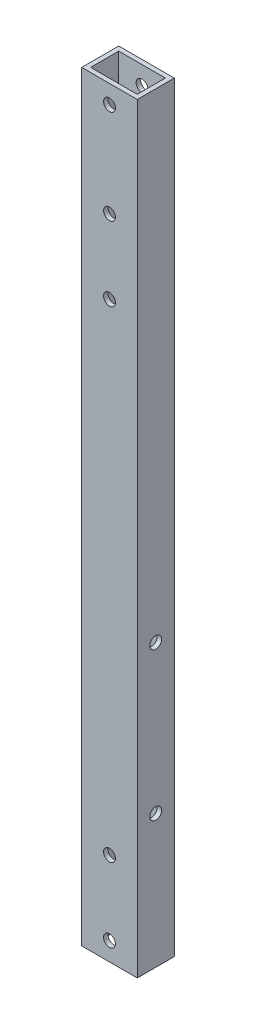
ISO-10303-21;
HEADER;
FILE_DESCRIPTION(('STEP AP214'),'2;1');
FILE_NAME('part.step','',(''),(''),'','','');
FILE_SCHEMA(('AUTOMOTIVE_DESIGN { 1 0 10303 214 1 1 1 1 }'));
ENDSEC;
DATA;
#1=APPLICATION_CONTEXT('core data for automotive mechanical design processes');
#2=APPLICATION_PROTOCOL_DEFINITION('international standard','automotive_design',2000,#1);
#3=PRODUCT_CONTEXT('',#1,'mechanical');
#4=PRODUCT('Part','Part','',(#3));
#5=PRODUCT_RELATED_PRODUCT_CATEGORY('part','',(#4));
#6=PRODUCT_DEFINITION_FORMATION('','',#4);
#7=PRODUCT_DEFINITION_CONTEXT('part definition',#1,'design');
#8=PRODUCT_DEFINITION('design','',#6,#7);
#9=PRODUCT_DEFINITION_SHAPE('','',#8);
#10=(LENGTH_UNIT() NAMED_UNIT(*) SI_UNIT(.MILLI.,.METRE.));
#11=(NAMED_UNIT(*) PLANE_ANGLE_UNIT() SI_UNIT($,.RADIAN.));
#12=(NAMED_UNIT(*) SI_UNIT($,.STERADIAN.) SOLID_ANGLE_UNIT());
#13=UNCERTAINTY_MEASURE_WITH_UNIT(LENGTH_MEASURE(1.E-05),#10,'distance_accuracy_value','');
#14=(GEOMETRIC_REPRESENTATION_CONTEXT(3) GLOBAL_UNCERTAINTY_ASSIGNED_CONTEXT((#13)) GLOBAL_UNIT_ASSIGNED_CONTEXT((#10,
#11,#12)) REPRESENTATION_CONTEXT('',''));
#15=CARTESIAN_POINT('',(0.,0.,0.));
#16=DIRECTION('',(0.,0.,1.));
#17=DIRECTION('',(1.,0.,0.));
#18=AXIS2_PLACEMENT_3D('',#15,#16,#17);
#19=CARTESIAN_POINT('',(7.5,110.,-5.));
#20=DIRECTION('',(-1.,0.,0.));
#21=DIRECTION('',(0.,0.,1.));
#22=AXIS2_PLACEMENT_3D('',#19,#20,#21);
#23=PLANE('',#22);
#24=CARTESIAN_POINT('',(7.5,-74.,0.));
#25=DIRECTION('',(1.,0.,0.));
#26=DIRECTION('',(0.,0.,-1.));
#27=AXIS2_PLACEMENT_3D('',#24,#25,#26);
#28=CIRCLE('',#27,1.60000000000001);
#29=CARTESIAN_POINT('',(7.5,-74.,-1.60000000000001));
#30=VERTEX_POINT('',#29);
#31=EDGE_CURVE('E154',#30,#30,#28,.T.);
#32=ORIENTED_EDGE('',*,*,#31,.F.);
#33=EDGE_LOOP('',(#32));
#34=FACE_BOUND('',#33,.T.);
#35=CARTESIAN_POINT('',(7.5,-34.,0.));
#36=DIRECTION('',(1.,0.,0.));
#37=DIRECTION('',(0.,0.,-1.));
#38=AXIS2_PLACEMENT_3D('',#35,#36,#37);
#39=CIRCLE('',#38,1.6);
#40=CARTESIAN_POINT('',(7.5,-34.,-1.6));
#41=VERTEX_POINT('',#40);
#42=EDGE_CURVE('E166',#41,#41,#39,.T.);
#43=ORIENTED_EDGE('',*,*,#42,.F.);
#44=EDGE_LOOP('',(#43));
#45=FACE_BOUND('',#44,.T.);
#46=DIRECTION('',(0.,0.,-1.));
#47=VECTOR('',#46,1.);
#48=CARTESIAN_POINT('',(7.5,95.5,5.));
#49=LINE('',#48,#47);
#50=CARTESIAN_POINT('',(7.5,95.5,5.));
#51=VERTEX_POINT('',#50);
#52=CARTESIAN_POINT('',(7.5,95.5,-5.));
#53=VERTEX_POINT('',#52);
#54=EDGE_CURVE('E96',#51,#53,#49,.T.);
#55=ORIENTED_EDGE('',*,*,#54,.F.);
#56=DIRECTION('',(0.,-1.,0.));
#57=VECTOR('',#56,1.);
#58=CARTESIAN_POINT('',(7.5,110.,5.));
#59=LINE('',#58,#57);
#60=CARTESIAN_POINT('',(7.5,-110.,5.));
#61=VERTEX_POINT('',#60);
#62=EDGE_CURVE('E106',#51,#61,#59,.T.);
#63=ORIENTED_EDGE('',*,*,#62,.T.);
#64=DIRECTION('',(0.,0.,-1.));
#65=VECTOR('',#64,1.);
#66=CARTESIAN_POINT('',(7.5,-110.,-5.));
#67=LINE('',#66,#65);
#68=CARTESIAN_POINT('',(7.5,-110.,-5.));
#69=VERTEX_POINT('',#68);
#70=EDGE_CURVE('E212',#61,#69,#67,.T.);
#71=ORIENTED_EDGE('',*,*,#70,.T.);
#72=DIRECTION('',(0.,-1.,0.));
#73=VECTOR('',#72,1.);
#74=CARTESIAN_POINT('',(7.5,110.,-5.));
#75=LINE('',#74,#73);
#76=EDGE_CURVE('E40',#53,#69,#75,.T.);
#77=ORIENTED_EDGE('',*,*,#76,.F.);
#78=EDGE_LOOP('',(#55,#63,#71,#77));
#79=FACE_BOUND('',#78,.T.);
#80=ADVANCED_FACE('F32',(#34,#45,#79),#23,.F.);
#81=CARTESIAN_POINT('',(-7.5,110.,-5.));
#82=DIRECTION('',(0.,0.,1.));
#83=DIRECTION('',(1.,0.,0.));
#84=AXIS2_PLACEMENT_3D('',#81,#82,#83);
#85=PLANE('',#84);
#86=CARTESIAN_POINT('',(0.,90.5,-5.));
#87=DIRECTION('',(0.,0.,-1.));
#88=DIRECTION('',(-1.,0.,0.));
#89=AXIS2_PLACEMENT_3D('',#86,#87,#88);
#90=CIRCLE('',#89,1.6);
#91=CARTESIAN_POINT('',(-1.6,90.5,-5.));
#92=VERTEX_POINT('',#91);
#93=EDGE_CURVE('E383',#92,#92,#90,.T.);
#94=ORIENTED_EDGE('',*,*,#93,.F.);
#95=EDGE_LOOP('',(#94));
#96=FACE_BOUND('',#95,.T.);
#97=CARTESIAN_POINT('',(0.,-105.,-5.));
#98=DIRECTION('',(0.,0.,-1.));
#99=DIRECTION('',(-1.,0.,0.));
#100=AXIS2_PLACEMENT_3D('',#97,#98,#99);
#101=CIRCLE('',#100,1.60000000000001);
#102=CARTESIAN_POINT('',(-1.60000000000001,-105.,-5.));
#103=VERTEX_POINT('',#102);
#104=EDGE_CURVE('E178',#103,#103,#101,.T.);
#105=ORIENTED_EDGE('',*,*,#104,.F.);
#106=EDGE_LOOP('',(#105));
#107=FACE_BOUND('',#106,.T.);
#108=CARTESIAN_POINT('',(0.,-85.,-5.));
#109=DIRECTION('',(0.,0.,-1.));
#110=DIRECTION('',(-1.,0.,0.));
#111=AXIS2_PLACEMENT_3D('',#108,#109,#110);
#112=CIRCLE('',#111,1.6);
#113=CARTESIAN_POINT('',(-1.6,-85.,-5.));
#114=VERTEX_POINT('',#113);
#115=EDGE_CURVE('E128',#114,#114,#112,.T.);
#116=ORIENTED_EDGE('',*,*,#115,.F.);
#117=EDGE_LOOP('',(#116));
#118=FACE_BOUND('',#117,.T.);
#119=CARTESIAN_POINT('',(0.,45.,-5.));
#120=DIRECTION('',(0.,0.,-1.));
#121=DIRECTION('',(-1.,0.,0.));
#122=AXIS2_PLACEMENT_3D('',#119,#120,#121);
#123=CIRCLE('',#122,1.6);
#124=CARTESIAN_POINT('',(-1.6,45.,-5.));
#125=VERTEX_POINT('',#124);
#126=EDGE_CURVE('E161',#125,#125,#123,.T.);
#127=ORIENTED_EDGE('',*,*,#126,.F.);
#128=EDGE_LOOP('',(#127));
#129=FACE_BOUND('',#128,.T.);
#130=CARTESIAN_POINT('',(0.,65.,-5.));
#131=DIRECTION('',(0.,0.,-1.));
#132=DIRECTION('',(-1.,0.,0.));
#133=AXIS2_PLACEMENT_3D('',#130,#131,#132);
#134=CIRCLE('',#133,1.6);
#135=CARTESIAN_POINT('',(-1.6,65.,-5.));
#136=VERTEX_POINT('',#135);
#137=EDGE_CURVE('E239',#136,#136,#134,.T.);
#138=ORIENTED_EDGE('',*,*,#137,.F.);
#139=EDGE_LOOP('',(#138));
#140=FACE_BOUND('',#139,.T.);
#141=DIRECTION('',(-1.,0.,0.));
#142=VECTOR('',#141,1.);
#143=CARTESIAN_POINT('',(7.5,95.5,-5.));
#144=LINE('',#143,#142);
#145=CARTESIAN_POINT('',(-7.5,95.5,-5.));
#146=VERTEX_POINT('',#145);
#147=EDGE_CURVE('E108',#53,#146,#144,.T.);
#148=ORIENTED_EDGE('',*,*,#147,.F.);
#149=ORIENTED_EDGE('',*,*,#76,.T.);
#150=DIRECTION('',(-1.,0.,0.));
#151=VECTOR('',#150,1.);
#152=CARTESIAN_POINT('',(-7.5,-110.,-5.));
#153=LINE('',#152,#151);
#154=CARTESIAN_POINT('',(-7.5,-110.,-5.));
#155=VERTEX_POINT('',#154);
#156=EDGE_CURVE('E214',#69,#155,#153,.T.);
#157=ORIENTED_EDGE('',*,*,#156,.T.);
#158=DIRECTION('',(0.,-1.,0.));
#159=VECTOR('',#158,1.);
#160=CARTESIAN_POINT('',(-7.5,110.,-5.));
#161=LINE('',#160,#159);
#162=EDGE_CURVE('E116',#146,#155,#161,.T.);
#163=ORIENTED_EDGE('',*,*,#162,.F.);
#164=EDGE_LOOP('',(#148,#149,#157,#163));
#165=FACE_BOUND('',#164,.T.);
#166=ADVANCED_FACE('F226',(#96,#107,#118,#129,#140,#165),#85,.F.);
#167=CARTESIAN_POINT('',(-7.5,110.,-5.));
#168=DIRECTION('',(1.,0.,0.));
#169=DIRECTION('',(0.,0.,-1.));
#170=AXIS2_PLACEMENT_3D('',#167,#168,#169);
#171=PLANE('',#170);
#172=CARTESIAN_POINT('',(-7.5,-74.,0.));
#173=DIRECTION('',(1.,0.,0.));
#174=DIRECTION('',(0.,0.,-1.));
#175=AXIS2_PLACEMENT_3D('',#172,#173,#174);
#176=CIRCLE('',#175,1.60000000000001);
#177=CARTESIAN_POINT('',(-7.5,-74.,-1.60000000000001));
#178=VERTEX_POINT('',#177);
#179=EDGE_CURVE('E169',#178,#178,#176,.T.);
#180=ORIENTED_EDGE('',*,*,#179,.T.);
#181=EDGE_LOOP('',(#180));
#182=FACE_BOUND('',#181,.T.);
#183=CARTESIAN_POINT('',(-7.5,-34.,0.));
#184=DIRECTION('',(1.,0.,0.));
#185=DIRECTION('',(0.,0.,-1.));
#186=AXIS2_PLACEMENT_3D('',#183,#184,#185);
#187=CIRCLE('',#186,1.6);
#188=CARTESIAN_POINT('',(-7.5,-34.,-1.6));
#189=VERTEX_POINT('',#188);
#190=EDGE_CURVE('E138',#189,#189,#187,.T.);
#191=ORIENTED_EDGE('',*,*,#190,.T.);
#192=EDGE_LOOP('',(#191));
#193=FACE_BOUND('',#192,.T.);
#194=DIRECTION('',(0.,0.,1.));
#195=VECTOR('',#194,1.);
#196=CARTESIAN_POINT('',(-7.5,95.5,-5.));
#197=LINE('',#196,#195);
#198=CARTESIAN_POINT('',(-7.5,95.5,5.));
#199=VERTEX_POINT('',#198);
#200=EDGE_CURVE('E47',#146,#199,#197,.T.);
#201=ORIENTED_EDGE('',*,*,#200,.F.);
#202=ORIENTED_EDGE('',*,*,#162,.T.);
#203=DIRECTION('',(0.,0.,1.));
#204=VECTOR('',#203,1.);
#205=CARTESIAN_POINT('',(-7.5,-110.,-5.));
#206=LINE('',#205,#204);
#207=CARTESIAN_POINT('',(-7.5,-110.,5.));
#208=VERTEX_POINT('',#207);
#209=EDGE_CURVE('E118',#155,#208,#206,.T.);
#210=ORIENTED_EDGE('',*,*,#209,.T.);
#211=DIRECTION('',(0.,-1.,0.));
#212=VECTOR('',#211,1.);
#213=CARTESIAN_POINT('',(-7.5,110.,5.));
#214=LINE('',#213,#212);
#215=EDGE_CURVE('E114',#199,#208,#214,.T.);
#216=ORIENTED_EDGE('',*,*,#215,.F.);
#217=EDGE_LOOP('',(#201,#202,#210,#216));
#218=FACE_BOUND('',#217,.T.);
#219=ADVANCED_FACE('F219',(#182,#193,#218),#171,.F.);
#220=CARTESIAN_POINT('',(-7.5,110.,5.));
#221=DIRECTION('',(0.,0.,-1.));
#222=DIRECTION('',(-1.,0.,0.));
#223=AXIS2_PLACEMENT_3D('',#220,#221,#222);
#224=PLANE('',#223);
#225=CARTESIAN_POINT('',(0.,90.5,5.));
#226=DIRECTION('',(0.,0.,-1.));
#227=DIRECTION('',(-1.,0.,0.));
#228=AXIS2_PLACEMENT_3D('',#225,#226,#227);
#229=CIRCLE('',#228,1.6);
#230=CARTESIAN_POINT('',(-1.6,90.5,5.));
#231=VERTEX_POINT('',#230);
#232=EDGE_CURVE('E101',#231,#231,#229,.T.);
#233=ORIENTED_EDGE('',*,*,#232,.T.);
#234=EDGE_LOOP('',(#233));
#235=FACE_BOUND('',#234,.T.);
#236=CARTESIAN_POINT('',(0.,-105.,5.));
#237=DIRECTION('',(0.,0.,-1.));
#238=DIRECTION('',(-1.,0.,0.));
#239=AXIS2_PLACEMENT_3D('',#236,#237,#238);
#240=CIRCLE('',#239,1.60000000000001);
#241=CARTESIAN_POINT('',(-1.60000000000001,-105.,5.));
#242=VERTEX_POINT('',#241);
#243=EDGE_CURVE('E133',#242,#242,#240,.T.);
#244=ORIENTED_EDGE('',*,*,#243,.T.);
#245=EDGE_LOOP('',(#244));
#246=FACE_BOUND('',#245,.T.);
#247=CARTESIAN_POINT('',(0.,-85.,5.));
#248=DIRECTION('',(0.,0.,-1.));
#249=DIRECTION('',(-1.,0.,0.));
#250=AXIS2_PLACEMENT_3D('',#247,#248,#249);
#251=CIRCLE('',#250,1.6);
#252=CARTESIAN_POINT('',(-1.6,-85.,5.));
#253=VERTEX_POINT('',#252);
#254=EDGE_CURVE('E189',#253,#253,#251,.T.);
#255=ORIENTED_EDGE('',*,*,#254,.T.);
#256=EDGE_LOOP('',(#255));
#257=FACE_BOUND('',#256,.T.);
#258=CARTESIAN_POINT('',(0.,45.,5.));
#259=DIRECTION('',(0.,0.,-1.));
#260=DIRECTION('',(-1.,0.,0.));
#261=AXIS2_PLACEMENT_3D('',#258,#259,#260);
#262=CIRCLE('',#261,1.6);
#263=CARTESIAN_POINT('',(-1.6,45.,5.));
#264=VERTEX_POINT('',#263);
#265=EDGE_CURVE('E241',#264,#264,#262,.T.);
#266=ORIENTED_EDGE('',*,*,#265,.T.);
#267=EDGE_LOOP('',(#266));
#268=FACE_BOUND('',#267,.T.);
#269=CARTESIAN_POINT('',(0.,65.,5.));
#270=DIRECTION('',(0.,0.,-1.));
#271=DIRECTION('',(-1.,0.,0.));
#272=AXIS2_PLACEMENT_3D('',#269,#270,#271);
#273=CIRCLE('',#272,1.6);
#274=CARTESIAN_POINT('',(-1.6,65.,5.));
#275=VERTEX_POINT('',#274);
#276=EDGE_CURVE('E147',#275,#275,#273,.T.);
#277=ORIENTED_EDGE('',*,*,#276,.T.);
#278=EDGE_LOOP('',(#277));
#279=FACE_BOUND('',#278,.T.);
#280=DIRECTION('',(1.,0.,0.));
#281=VECTOR('',#280,1.);
#282=CARTESIAN_POINT('',(-7.5,95.5,5.));
#283=LINE('',#282,#281);
#284=EDGE_CURVE('E93',#199,#51,#283,.T.);
#285=ORIENTED_EDGE('',*,*,#284,.F.);
#286=ORIENTED_EDGE('',*,*,#215,.T.);
#287=DIRECTION('',(1.,0.,0.));
#288=VECTOR('',#287,1.);
#289=CARTESIAN_POINT('',(-7.5,-110.,5.));
#290=LINE('',#289,#288);
#291=EDGE_CURVE('E112',#208,#61,#290,.T.);
#292=ORIENTED_EDGE('',*,*,#291,.T.);
#293=ORIENTED_EDGE('',*,*,#62,.F.);
#294=EDGE_LOOP('',(#285,#286,#292,#293));
#295=FACE_BOUND('',#294,.T.);
#296=ADVANCED_FACE('F110',(#235,#246,#257,#268,#279,#295),#224,.F.);
#297=CARTESIAN_POINT('',(-6.3,110.,-3.8));
#298=DIRECTION('',(1.,0.,0.));
#299=DIRECTION('',(0.,0.,-1.));
#300=AXIS2_PLACEMENT_3D('',#297,#298,#299);
#301=PLANE('',#300);
#302=CARTESIAN_POINT('',(-6.3,-34.,0.));
#303=DIRECTION('',(1.,0.,0.));
#304=DIRECTION('',(0.,0.,-1.));
#305=AXIS2_PLACEMENT_3D('',#302,#303,#304);
#306=CIRCLE('',#305,1.6);
#307=CARTESIAN_POINT('',(-6.3,-34.,-1.6));
#308=VERTEX_POINT('',#307);
#309=EDGE_CURVE('E142',#308,#308,#306,.T.);
#310=ORIENTED_EDGE('',*,*,#309,.F.);
#311=EDGE_LOOP('',(#310));
#312=FACE_BOUND('',#311,.T.);
#313=CARTESIAN_POINT('',(-6.3,-74.,0.));
#314=DIRECTION('',(1.,0.,0.));
#315=DIRECTION('',(0.,0.,-1.));
#316=AXIS2_PLACEMENT_3D('',#313,#314,#315);
#317=CIRCLE('',#316,1.60000000000001);
#318=CARTESIAN_POINT('',(-6.3,-74.,-1.60000000000001));
#319=VERTEX_POINT('',#318);
#320=EDGE_CURVE('E137',#319,#319,#317,.T.);
#321=ORIENTED_EDGE('',*,*,#320,.F.);
#322=EDGE_LOOP('',(#321));
#323=FACE_BOUND('',#322,.T.);
#324=DIRECTION('',(0.,-1.,0.));
#325=VECTOR('',#324,1.);
#326=CARTESIAN_POINT('',(-6.3,110.,-3.8));
#327=LINE('',#326,#325);
#328=CARTESIAN_POINT('',(-6.3,95.5,-3.8));
#329=VERTEX_POINT('',#328);
#330=CARTESIAN_POINT('',(-6.3,-110.,-3.8));
#331=VERTEX_POINT('',#330);
#332=EDGE_CURVE('E204',#329,#331,#327,.T.);
#333=ORIENTED_EDGE('',*,*,#332,.F.);
#334=DIRECTION('',(0.,0.,1.));
#335=VECTOR('',#334,1.);
#336=CARTESIAN_POINT('',(-6.3,95.5,-3.8));
#337=LINE('',#336,#335);
#338=CARTESIAN_POINT('',(-6.3,95.5,3.8));
#339=VERTEX_POINT('',#338);
#340=EDGE_CURVE('E55',#329,#339,#337,.T.);
#341=ORIENTED_EDGE('',*,*,#340,.T.);
#342=DIRECTION('',(0.,-1.,0.));
#343=VECTOR('',#342,1.);
#344=CARTESIAN_POINT('',(-6.3,110.,3.8));
#345=LINE('',#344,#343);
#346=CARTESIAN_POINT('',(-6.3,-110.,3.8));
#347=VERTEX_POINT('',#346);
#348=EDGE_CURVE('E210',#339,#347,#345,.T.);
#349=ORIENTED_EDGE('',*,*,#348,.T.);
#350=DIRECTION('',(0.,0.,1.));
#351=VECTOR('',#350,1.);
#352=CARTESIAN_POINT('',(-6.3,-110.,-3.8));
#353=LINE('',#352,#351);
#354=EDGE_CURVE('E192',#331,#347,#353,.T.);
#355=ORIENTED_EDGE('',*,*,#354,.F.);
#356=EDGE_LOOP('',(#333,#341,#349,#355));
#357=FACE_BOUND('',#356,.T.);
#358=ADVANCED_FACE('F306',(#312,#323,#357),#301,.T.);
#359=CARTESIAN_POINT('',(-6.3,110.,3.8));
#360=DIRECTION('',(0.,0.,-1.));
#361=DIRECTION('',(-1.,0.,0.));
#362=AXIS2_PLACEMENT_3D('',#359,#360,#361);
#363=PLANE('',#362);
#364=CARTESIAN_POINT('',(0.,90.5,3.8));
#365=DIRECTION('',(0.,0.,-1.));
#366=DIRECTION('',(-1.,0.,0.));
#367=AXIS2_PLACEMENT_3D('',#364,#365,#366);
#368=CIRCLE('',#367,1.6);
#369=CARTESIAN_POINT('',(-1.6,90.5,3.8));
#370=VERTEX_POINT('',#369);
#371=EDGE_CURVE('E385',#370,#370,#368,.T.);
#372=ORIENTED_EDGE('',*,*,#371,.F.);
#373=EDGE_LOOP('',(#372));
#374=FACE_BOUND('',#373,.T.);
#375=CARTESIAN_POINT('',(0.,65.,3.8));
#376=DIRECTION('',(0.,0.,-1.));
#377=DIRECTION('',(-1.,0.,0.));
#378=AXIS2_PLACEMENT_3D('',#375,#376,#377);
#379=CIRCLE('',#378,1.6);
#380=CARTESIAN_POINT('',(-1.6,65.,3.8));
#381=VERTEX_POINT('',#380);
#382=EDGE_CURVE('E150',#381,#381,#379,.T.);
#383=ORIENTED_EDGE('',*,*,#382,.F.);
#384=EDGE_LOOP('',(#383));
#385=FACE_BOUND('',#384,.T.);
#386=CARTESIAN_POINT('',(0.,45.,3.8));
#387=DIRECTION('',(0.,0.,-1.));
#388=DIRECTION('',(-1.,0.,0.));
#389=AXIS2_PLACEMENT_3D('',#386,#387,#388);
#390=CIRCLE('',#389,1.6);
#391=CARTESIAN_POINT('',(-1.6,45.,3.8));
#392=VERTEX_POINT('',#391);
#393=EDGE_CURVE('E146',#392,#392,#390,.T.);
#394=ORIENTED_EDGE('',*,*,#393,.F.);
#395=EDGE_LOOP('',(#394));
#396=FACE_BOUND('',#395,.T.);
#397=CARTESIAN_POINT('',(0.,-85.,3.8));
#398=DIRECTION('',(0.,0.,-1.));
#399=DIRECTION('',(-1.,0.,0.));
#400=AXIS2_PLACEMENT_3D('',#397,#398,#399);
#401=CIRCLE('',#400,1.6);
#402=CARTESIAN_POINT('',(-1.6,-85.,3.8));
#403=VERTEX_POINT('',#402);
#404=EDGE_CURVE('E132',#403,#403,#401,.T.);
#405=ORIENTED_EDGE('',*,*,#404,.F.);
#406=EDGE_LOOP('',(#405));
#407=FACE_BOUND('',#406,.T.);
#408=CARTESIAN_POINT('',(0.,-105.,3.8));
#409=DIRECTION('',(0.,0.,-1.));
#410=DIRECTION('',(-1.,0.,0.));
#411=AXIS2_PLACEMENT_3D('',#408,#409,#410);
#412=CIRCLE('',#411,1.60000000000001);
#413=CARTESIAN_POINT('',(-1.60000000000001,-105.,3.8));
#414=VERTEX_POINT('',#413);
#415=EDGE_CURVE('E127',#414,#414,#412,.T.);
#416=ORIENTED_EDGE('',*,*,#415,.F.);
#417=EDGE_LOOP('',(#416));
#418=FACE_BOUND('',#417,.T.);
#419=ORIENTED_EDGE('',*,*,#348,.F.);
#420=DIRECTION('',(1.,0.,0.));
#421=VECTOR('',#420,1.);
#422=CARTESIAN_POINT('',(-6.3,95.5,3.8));
#423=LINE('',#422,#421);
#424=CARTESIAN_POINT('',(6.3,95.5,3.8));
#425=VERTEX_POINT('',#424);
#426=EDGE_CURVE('E233',#339,#425,#423,.T.);
#427=ORIENTED_EDGE('',*,*,#426,.T.);
#428=DIRECTION('',(0.,-1.,0.));
#429=VECTOR('',#428,1.);
#430=CARTESIAN_POINT('',(6.3,110.,3.8));
#431=LINE('',#430,#429);
#432=CARTESIAN_POINT('',(6.3,-110.,3.8));
#433=VERTEX_POINT('',#432);
#434=EDGE_CURVE('E208',#425,#433,#431,.T.);
#435=ORIENTED_EDGE('',*,*,#434,.T.);
#436=DIRECTION('',(1.,0.,0.));
#437=VECTOR('',#436,1.);
#438=CARTESIAN_POINT('',(-6.3,-110.,3.8));
#439=LINE('',#438,#437);
#440=EDGE_CURVE('E195',#347,#433,#439,.T.);
#441=ORIENTED_EDGE('',*,*,#440,.F.);
#442=EDGE_LOOP('',(#419,#427,#435,#441));
#443=FACE_BOUND('',#442,.T.);
#444=ADVANCED_FACE('F316',(#374,#385,#396,#407,#418,#443),#363,.T.);
#445=CARTESIAN_POINT('',(6.3,110.,-3.8));
#446=DIRECTION('',(-1.,0.,0.));
#447=DIRECTION('',(0.,0.,1.));
#448=AXIS2_PLACEMENT_3D('',#445,#446,#447);
#449=PLANE('',#448);
#450=CARTESIAN_POINT('',(6.3,-34.,0.));
#451=DIRECTION('',(-1.,0.,0.));
#452=DIRECTION('',(0.,0.,1.));
#453=AXIS2_PLACEMENT_3D('',#450,#451,#452);
#454=CIRCLE('',#453,1.6);
#455=CARTESIAN_POINT('',(6.3,-34.,1.6));
#456=VERTEX_POINT('',#455);
#457=EDGE_CURVE('E139',#456,#456,#454,.T.);
#458=ORIENTED_EDGE('',*,*,#457,.F.);
#459=EDGE_LOOP('',(#458));
#460=FACE_BOUND('',#459,.T.);
#461=CARTESIAN_POINT('',(6.3,-74.,0.));
#462=DIRECTION('',(-1.,0.,0.));
#463=DIRECTION('',(0.,0.,1.));
#464=AXIS2_PLACEMENT_3D('',#461,#462,#463);
#465=CIRCLE('',#464,1.60000000000001);
#466=CARTESIAN_POINT('',(6.3,-74.,1.60000000000001));
#467=VERTEX_POINT('',#466);
#468=EDGE_CURVE('E134',#467,#467,#465,.T.);
#469=ORIENTED_EDGE('',*,*,#468,.F.);
#470=EDGE_LOOP('',(#469));
#471=FACE_BOUND('',#470,.T.);
#472=ORIENTED_EDGE('',*,*,#434,.F.);
#473=DIRECTION('',(0.,0.,-1.));
#474=VECTOR('',#473,1.);
#475=CARTESIAN_POINT('',(6.3,95.5,-3.8));
#476=LINE('',#475,#474);
#477=CARTESIAN_POINT('',(6.3,95.5,-3.8));
#478=VERTEX_POINT('',#477);
#479=EDGE_CURVE('E228',#425,#478,#476,.T.);
#480=ORIENTED_EDGE('',*,*,#479,.T.);
#481=DIRECTION('',(0.,-1.,0.));
#482=VECTOR('',#481,1.);
#483=CARTESIAN_POINT('',(6.3,110.,-3.8));
#484=LINE('',#483,#482);
#485=CARTESIAN_POINT('',(6.3,-110.,-3.8));
#486=VERTEX_POINT('',#485);
#487=EDGE_CURVE('E206',#478,#486,#484,.T.);
#488=ORIENTED_EDGE('',*,*,#487,.T.);
#489=DIRECTION('',(0.,0.,-1.));
#490=VECTOR('',#489,1.);
#491=CARTESIAN_POINT('',(6.3,-110.,-3.8));
#492=LINE('',#491,#490);
#493=EDGE_CURVE('E198',#433,#486,#492,.T.);
#494=ORIENTED_EDGE('',*,*,#493,.F.);
#495=EDGE_LOOP('',(#472,#480,#488,#494));
#496=FACE_BOUND('',#495,.T.);
#497=ADVANCED_FACE('F320',(#460,#471,#496),#449,.T.);
#498=CARTESIAN_POINT('',(-6.3,110.,-3.8));
#499=DIRECTION('',(0.,0.,1.));
#500=DIRECTION('',(1.,0.,0.));
#501=AXIS2_PLACEMENT_3D('',#498,#499,#500);
#502=PLANE('',#501);
#503=CARTESIAN_POINT('',(0.,90.5,-3.8));
#504=DIRECTION('',(0.,0.,1.));
#505=DIRECTION('',(1.,0.,0.));
#506=AXIS2_PLACEMENT_3D('',#503,#504,#505);
#507=CIRCLE('',#506,1.6);
#508=CARTESIAN_POINT('',(1.6,90.5,-3.8));
#509=VERTEX_POINT('',#508);
#510=EDGE_CURVE('E35',#509,#509,#507,.T.);
#511=ORIENTED_EDGE('',*,*,#510,.F.);
#512=EDGE_LOOP('',(#511));
#513=FACE_BOUND('',#512,.T.);
#514=CARTESIAN_POINT('',(0.,65.,-3.8));
#515=DIRECTION('',(0.,0.,1.));
#516=DIRECTION('',(1.,0.,0.));
#517=AXIS2_PLACEMENT_3D('',#514,#515,#516);
#518=CIRCLE('',#517,1.6);
#519=CARTESIAN_POINT('',(1.6,65.,-3.8));
#520=VERTEX_POINT('',#519);
#521=EDGE_CURVE('E148',#520,#520,#518,.T.);
#522=ORIENTED_EDGE('',*,*,#521,.F.);
#523=EDGE_LOOP('',(#522));
#524=FACE_BOUND('',#523,.T.);
#525=CARTESIAN_POINT('',(0.,45.,-3.8));
#526=DIRECTION('',(0.,0.,1.));
#527=DIRECTION('',(1.,0.,0.));
#528=AXIS2_PLACEMENT_3D('',#525,#526,#527);
#529=CIRCLE('',#528,1.6);
#530=CARTESIAN_POINT('',(1.6,45.,-3.8));
#531=VERTEX_POINT('',#530);
#532=EDGE_CURVE('E143',#531,#531,#529,.T.);
#533=ORIENTED_EDGE('',*,*,#532,.F.);
#534=EDGE_LOOP('',(#533));
#535=FACE_BOUND('',#534,.T.);
#536=CARTESIAN_POINT('',(0.,-85.,-3.8));
#537=DIRECTION('',(0.,0.,1.));
#538=DIRECTION('',(1.,0.,0.));
#539=AXIS2_PLACEMENT_3D('',#536,#537,#538);
#540=CIRCLE('',#539,1.6);
#541=CARTESIAN_POINT('',(1.6,-85.,-3.8));
#542=VERTEX_POINT('',#541);
#543=EDGE_CURVE('E129',#542,#542,#540,.T.);
#544=ORIENTED_EDGE('',*,*,#543,.F.);
#545=EDGE_LOOP('',(#544));
#546=FACE_BOUND('',#545,.T.);
#547=CARTESIAN_POINT('',(0.,-105.,-3.8));
#548=DIRECTION('',(0.,0.,1.));
#549=DIRECTION('',(1.,0.,0.));
#550=AXIS2_PLACEMENT_3D('',#547,#548,#549);
#551=CIRCLE('',#550,1.60000000000001);
#552=CARTESIAN_POINT('',(1.60000000000001,-105.,-3.8));
#553=VERTEX_POINT('',#552);
#554=EDGE_CURVE('E124',#553,#553,#551,.T.);
#555=ORIENTED_EDGE('',*,*,#554,.F.);
#556=EDGE_LOOP('',(#555));
#557=FACE_BOUND('',#556,.T.);
#558=ORIENTED_EDGE('',*,*,#487,.F.);
#559=DIRECTION('',(-1.,0.,0.));
#560=VECTOR('',#559,1.);
#561=CARTESIAN_POINT('',(-6.3,95.5,-3.8));
#562=LINE('',#561,#560);
#563=EDGE_CURVE('E11',#478,#329,#562,.T.);
#564=ORIENTED_EDGE('',*,*,#563,.T.);
#565=ORIENTED_EDGE('',*,*,#332,.T.);
#566=DIRECTION('',(-1.,0.,0.));
#567=VECTOR('',#566,1.);
#568=CARTESIAN_POINT('',(-6.3,-110.,-3.8));
#569=LINE('',#568,#567);
#570=EDGE_CURVE('E201',#486,#331,#569,.T.);
#571=ORIENTED_EDGE('',*,*,#570,.F.);
#572=EDGE_LOOP('',(#558,#564,#565,#571));
#573=FACE_BOUND('',#572,.T.);
#574=ADVANCED_FACE('F313',(#513,#524,#535,#546,#557,#573),#502,.T.);
#575=CARTESIAN_POINT('',(0.,-110.,0.));
#576=DIRECTION('',(0.,1.,0.));
#577=DIRECTION('',(0.,0.,1.));
#578=AXIS2_PLACEMENT_3D('',#575,#576,#577);
#579=PLANE('',#578);
#580=ORIENTED_EDGE('',*,*,#70,.F.);
#581=ORIENTED_EDGE('',*,*,#291,.F.);
#582=ORIENTED_EDGE('',*,*,#209,.F.);
#583=ORIENTED_EDGE('',*,*,#156,.F.);
#584=EDGE_LOOP('',(#580,#581,#582,#583));
#585=FACE_BOUND('',#584,.T.);
#586=ORIENTED_EDGE('',*,*,#354,.T.);
#587=ORIENTED_EDGE('',*,*,#440,.T.);
#588=ORIENTED_EDGE('',*,*,#493,.T.);
#589=ORIENTED_EDGE('',*,*,#570,.T.);
#590=EDGE_LOOP('',(#586,#587,#588,#589));
#591=FACE_BOUND('',#590,.T.);
#592=ADVANCED_FACE('F223',(#585,#591),#579,.F.);
#593=CARTESIAN_POINT('',(0.,-105.,95.));
#594=DIRECTION('',(0.,0.,-1.));
#595=DIRECTION('',(-1.,0.,0.));
#596=AXIS2_PLACEMENT_3D('',#593,#594,#595);
#597=CYLINDRICAL_SURFACE('',#596,1.60000000000001);
#598=ORIENTED_EDGE('',*,*,#554,.T.);
#599=EDGE_LOOP('',(#598));
#600=FACE_BOUND('',#599,.T.);
#601=ORIENTED_EDGE('',*,*,#104,.T.);
#602=EDGE_LOOP('',(#601));
#603=FACE_BOUND('',#602,.T.);
#604=ADVANCED_FACE('F312',(#600,#603),#597,.F.);
#605=CARTESIAN_POINT('',(0.,-85.,95.));
#606=DIRECTION('',(0.,0.,-1.));
#607=DIRECTION('',(-1.,0.,0.));
#608=AXIS2_PLACEMENT_3D('',#605,#606,#607);
#609=CYLINDRICAL_SURFACE('',#608,1.6);
#610=ORIENTED_EDGE('',*,*,#543,.T.);
#611=EDGE_LOOP('',(#610));
#612=FACE_BOUND('',#611,.T.);
#613=ORIENTED_EDGE('',*,*,#115,.T.);
#614=EDGE_LOOP('',(#613));
#615=FACE_BOUND('',#614,.T.);
#616=ADVANCED_FACE('F330',(#612,#615),#609,.F.);
#617=ORIENTED_EDGE('',*,*,#415,.T.);
#618=EDGE_LOOP('',(#617));
#619=FACE_BOUND('',#618,.T.);
#620=ORIENTED_EDGE('',*,*,#243,.F.);
#621=EDGE_LOOP('',(#620));
#622=FACE_BOUND('',#621,.T.);
#623=ADVANCED_FACE('F332',(#619,#622),#597,.F.);
#624=ORIENTED_EDGE('',*,*,#404,.T.);
#625=EDGE_LOOP('',(#624));
#626=FACE_BOUND('',#625,.T.);
#627=ORIENTED_EDGE('',*,*,#254,.F.);
#628=EDGE_LOOP('',(#627));
#629=FACE_BOUND('',#628,.T.);
#630=ADVANCED_FACE('F290',(#626,#629),#609,.F.);
#631=CARTESIAN_POINT('',(-7.5,-74.,0.));
#632=DIRECTION('',(1.,0.,0.));
#633=DIRECTION('',(0.,0.,-1.));
#634=AXIS2_PLACEMENT_3D('',#631,#632,#633);
#635=CYLINDRICAL_SURFACE('',#634,1.60000000000001);
#636=ORIENTED_EDGE('',*,*,#468,.T.);
#637=EDGE_LOOP('',(#636));
#638=FACE_BOUND('',#637,.T.);
#639=ORIENTED_EDGE('',*,*,#31,.T.);
#640=EDGE_LOOP('',(#639));
#641=FACE_BOUND('',#640,.T.);
#642=ADVANCED_FACE('F281',(#638,#641),#635,.F.);
#643=CARTESIAN_POINT('',(-7.5,-34.,0.));
#644=DIRECTION('',(1.,0.,0.));
#645=DIRECTION('',(0.,0.,-1.));
#646=AXIS2_PLACEMENT_3D('',#643,#644,#645);
#647=CYLINDRICAL_SURFACE('',#646,1.6);
#648=ORIENTED_EDGE('',*,*,#457,.T.);
#649=EDGE_LOOP('',(#648));
#650=FACE_BOUND('',#649,.T.);
#651=ORIENTED_EDGE('',*,*,#42,.T.);
#652=EDGE_LOOP('',(#651));
#653=FACE_BOUND('',#652,.T.);
#654=ADVANCED_FACE('F278',(#650,#653),#647,.F.);
#655=ORIENTED_EDGE('',*,*,#320,.T.);
#656=EDGE_LOOP('',(#655));
#657=FACE_BOUND('',#656,.T.);
#658=ORIENTED_EDGE('',*,*,#179,.F.);
#659=EDGE_LOOP('',(#658));
#660=FACE_BOUND('',#659,.T.);
#661=ADVANCED_FACE('F280',(#657,#660),#635,.F.);
#662=ORIENTED_EDGE('',*,*,#309,.T.);
#663=EDGE_LOOP('',(#662));
#664=FACE_BOUND('',#663,.T.);
#665=ORIENTED_EDGE('',*,*,#190,.F.);
#666=EDGE_LOOP('',(#665));
#667=FACE_BOUND('',#666,.T.);
#668=ADVANCED_FACE('F265',(#664,#667),#647,.F.);
#669=CARTESIAN_POINT('',(0.,45.,5.));
#670=DIRECTION('',(0.,0.,-1.));
#671=DIRECTION('',(-1.,0.,0.));
#672=AXIS2_PLACEMENT_3D('',#669,#670,#671);
#673=CYLINDRICAL_SURFACE('',#672,1.6);
#674=ORIENTED_EDGE('',*,*,#532,.T.);
#675=EDGE_LOOP('',(#674));
#676=FACE_BOUND('',#675,.T.);
#677=ORIENTED_EDGE('',*,*,#126,.T.);
#678=EDGE_LOOP('',(#677));
#679=FACE_BOUND('',#678,.T.);
#680=ADVANCED_FACE('F248',(#676,#679),#673,.F.);
#681=CARTESIAN_POINT('',(0.,65.,5.));
#682=DIRECTION('',(0.,0.,-1.));
#683=DIRECTION('',(-1.,0.,0.));
#684=AXIS2_PLACEMENT_3D('',#681,#682,#683);
#685=CYLINDRICAL_SURFACE('',#684,1.6);
#686=ORIENTED_EDGE('',*,*,#521,.T.);
#687=EDGE_LOOP('',(#686));
#688=FACE_BOUND('',#687,.T.);
#689=ORIENTED_EDGE('',*,*,#137,.T.);
#690=EDGE_LOOP('',(#689));
#691=FACE_BOUND('',#690,.T.);
#692=ADVANCED_FACE('F255',(#688,#691),#685,.F.);
#693=ORIENTED_EDGE('',*,*,#393,.T.);
#694=EDGE_LOOP('',(#693));
#695=FACE_BOUND('',#694,.T.);
#696=ORIENTED_EDGE('',*,*,#265,.F.);
#697=EDGE_LOOP('',(#696));
#698=FACE_BOUND('',#697,.T.);
#699=ADVANCED_FACE('F257',(#695,#698),#673,.F.);
#700=ORIENTED_EDGE('',*,*,#382,.T.);
#701=EDGE_LOOP('',(#700));
#702=FACE_BOUND('',#701,.T.);
#703=ORIENTED_EDGE('',*,*,#276,.F.);
#704=EDGE_LOOP('',(#703));
#705=FACE_BOUND('',#704,.T.);
#706=ADVANCED_FACE('F259',(#702,#705),#685,.F.);
#707=CARTESIAN_POINT('',(0.,95.5,0.));
#708=DIRECTION('',(0.,1.,0.));
#709=DIRECTION('',(0.,0.,1.));
#710=AXIS2_PLACEMENT_3D('',#707,#708,#709);
#711=PLANE('',#710);
#712=ORIENTED_EDGE('',*,*,#563,.F.);
#713=ORIENTED_EDGE('',*,*,#479,.F.);
#714=ORIENTED_EDGE('',*,*,#426,.F.);
#715=ORIENTED_EDGE('',*,*,#340,.F.);
#716=EDGE_LOOP('',(#712,#713,#714,#715));
#717=FACE_BOUND('',#716,.T.);
#718=ORIENTED_EDGE('',*,*,#284,.T.);
#719=ORIENTED_EDGE('',*,*,#54,.T.);
#720=ORIENTED_EDGE('',*,*,#147,.T.);
#721=ORIENTED_EDGE('',*,*,#200,.T.);
#722=EDGE_LOOP('',(#718,#719,#720,#721));
#723=FACE_BOUND('',#722,.T.);
#724=ADVANCED_FACE('F95',(#717,#723),#711,.T.);
#725=CARTESIAN_POINT('',(0.,90.5,10.));
#726=DIRECTION('',(0.,0.,-1.));
#727=DIRECTION('',(-1.,0.,0.));
#728=AXIS2_PLACEMENT_3D('',#725,#726,#727);
#729=CYLINDRICAL_SURFACE('',#728,1.6);
#730=ORIENTED_EDGE('',*,*,#510,.T.);
#731=EDGE_LOOP('',(#730));
#732=FACE_BOUND('',#731,.T.);
#733=ORIENTED_EDGE('',*,*,#93,.T.);
#734=EDGE_LOOP('',(#733));
#735=FACE_BOUND('',#734,.T.);
#736=ADVANCED_FACE('F367',(#732,#735),#729,.F.);
#737=ORIENTED_EDGE('',*,*,#371,.T.);
#738=EDGE_LOOP('',(#737));
#739=FACE_BOUND('',#738,.T.);
#740=ORIENTED_EDGE('',*,*,#232,.F.);
#741=EDGE_LOOP('',(#740));
#742=FACE_BOUND('',#741,.T.);
#743=ADVANCED_FACE('F371',(#739,#742),#729,.F.);
#744=CLOSED_SHELL('',(#80,#166,#219,#296,#358,#444,#497,#574,#592,#604,#616,#623,#630,#642,#654,
#661,#668,#680,#692,#699,#706,#724,#736,#743));
#745=MANIFOLD_SOLID_BREP('B2',#744);
#746=ADVANCED_BREP_SHAPE_REPRESENTATION('',(#18,#745),#14);
#747=SHAPE_DEFINITION_REPRESENTATION(#9,#746);
ENDSEC;
END-ISO-10303-21;
